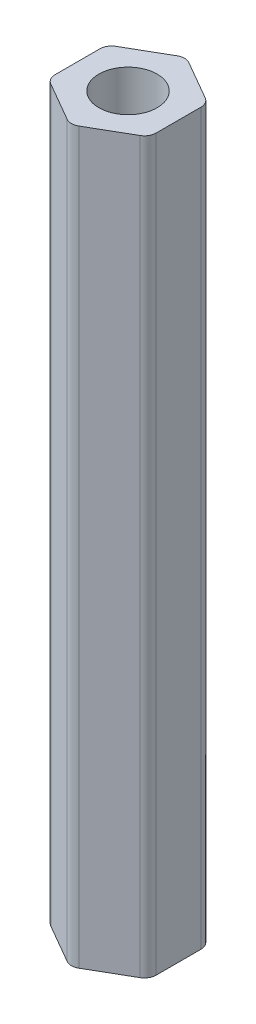
ISO-10303-21;
HEADER;
FILE_DESCRIPTION(('STEP AP214'),'2;1');
FILE_NAME('part.step','',(''),(''),'','','');
FILE_SCHEMA(('AUTOMOTIVE_DESIGN { 1 0 10303 214 1 1 1 1 }'));
ENDSEC;
DATA;
#1=APPLICATION_CONTEXT('core data for automotive mechanical design processes');
#2=APPLICATION_PROTOCOL_DEFINITION('international standard','automotive_design',2000,#1);
#3=PRODUCT_CONTEXT('',#1,'mechanical');
#4=PRODUCT('Part','Part','',(#3));
#5=PRODUCT_RELATED_PRODUCT_CATEGORY('part','',(#4));
#6=PRODUCT_DEFINITION_FORMATION('','',#4);
#7=PRODUCT_DEFINITION_CONTEXT('part definition',#1,'design');
#8=PRODUCT_DEFINITION('design','',#6,#7);
#9=PRODUCT_DEFINITION_SHAPE('','',#8);
#10=(LENGTH_UNIT() NAMED_UNIT(*) SI_UNIT(.MILLI.,.METRE.));
#11=(NAMED_UNIT(*) PLANE_ANGLE_UNIT() SI_UNIT($,.RADIAN.));
#12=(NAMED_UNIT(*) SI_UNIT($,.STERADIAN.) SOLID_ANGLE_UNIT());
#13=UNCERTAINTY_MEASURE_WITH_UNIT(LENGTH_MEASURE(1.E-05),#10,'distance_accuracy_value','');
#14=(GEOMETRIC_REPRESENTATION_CONTEXT(3) GLOBAL_UNCERTAINTY_ASSIGNED_CONTEXT((#13)) GLOBAL_UNIT_ASSIGNED_CONTEXT((#10,
#11,#12)) REPRESENTATION_CONTEXT('',''));
#15=CARTESIAN_POINT('',(0.,0.,0.));
#16=DIRECTION('',(0.,0.,1.));
#17=DIRECTION('',(1.,0.,0.));
#18=AXIS2_PLACEMENT_3D('',#15,#16,#17);
#19=CARTESIAN_POINT('',(0.,125.,0.));
#20=DIRECTION('',(0.,1.,0.));
#21=DIRECTION('',(0.,0.,1.));
#22=AXIS2_PLACEMENT_3D('',#19,#20,#21);
#23=PLANE('',#22);
#24=DIRECTION('',(0.,0.,1.));
#25=VECTOR('',#24,1.);
#26=CARTESIAN_POINT('',(-8.6602540378444,125.,-5.00000000000001));
#27=LINE('',#26,#25);
#28=CARTESIAN_POINT('',(-8.6602540378444,125.,-3.84529946162076));
#29=VERTEX_POINT('',#28);
#30=CARTESIAN_POINT('',(-8.6602540378444,125.,3.84529946162075));
#31=VERTEX_POINT('',#30);
#32=EDGE_CURVE('E229',#29,#31,#27,.T.);
#33=ORIENTED_EDGE('',*,*,#32,.T.);
#34=CARTESIAN_POINT('',(-6.6602540378444,125.,3.84529946162076));
#35=DIRECTION('',(0.,1.,0.));
#36=DIRECTION('',(0.,0.,1.));
#37=AXIS2_PLACEMENT_3D('',#34,#35,#36);
#38=CIRCLE('',#37,2.);
#39=CARTESIAN_POINT('',(-7.6602540378444,125.,5.57735026918963));
#40=VERTEX_POINT('',#39);
#41=EDGE_CURVE('E180',#31,#40,#38,.T.);
#42=ORIENTED_EDGE('',*,*,#41,.T.);
#43=DIRECTION('',(0.866025403784439,0.,0.5));
#44=VECTOR('',#43,1.);
#45=CARTESIAN_POINT('',(-8.6602540378444,125.,5.00000000000001));
#46=LINE('',#45,#44);
#47=CARTESIAN_POINT('',(-1.,125.,9.42264973081039));
#48=VERTEX_POINT('',#47);
#49=EDGE_CURVE('E142',#40,#48,#46,.T.);
#50=ORIENTED_EDGE('',*,*,#49,.T.);
#51=CARTESIAN_POINT('',(0.,125.,7.69059892324151));
#52=DIRECTION('',(0.,1.,0.));
#53=DIRECTION('',(0.,0.,1.));
#54=AXIS2_PLACEMENT_3D('',#51,#52,#53);
#55=CIRCLE('',#54,2.);
#56=CARTESIAN_POINT('',(0.999999999999997,125.,9.42264973081039));
#57=VERTEX_POINT('',#56);
#58=EDGE_CURVE('E171',#48,#57,#55,.T.);
#59=ORIENTED_EDGE('',*,*,#58,.T.);
#60=DIRECTION('',(0.866025403784439,0.,-0.5));
#61=VECTOR('',#60,1.);
#62=CARTESIAN_POINT('',(0.,125.,10.));
#63=LINE('',#62,#61);
#64=CARTESIAN_POINT('',(7.6602540378444,125.,5.57735026918963));
#65=VERTEX_POINT('',#64);
#66=EDGE_CURVE('E149',#57,#65,#63,.T.);
#67=ORIENTED_EDGE('',*,*,#66,.T.);
#68=CARTESIAN_POINT('',(6.6602540378444,125.,3.84529946162075));
#69=DIRECTION('',(0.,1.,0.));
#70=DIRECTION('',(0.,0.,1.));
#71=AXIS2_PLACEMENT_3D('',#68,#69,#70);
#72=CIRCLE('',#71,2.);
#73=CARTESIAN_POINT('',(8.6602540378444,125.,3.84529946162075));
#74=VERTEX_POINT('',#73);
#75=EDGE_CURVE('E173',#65,#74,#72,.T.);
#76=ORIENTED_EDGE('',*,*,#75,.T.);
#77=DIRECTION('',(0.,0.,-1.));
#78=VECTOR('',#77,1.);
#79=CARTESIAN_POINT('',(8.6602540378444,125.,5.));
#80=LINE('',#79,#78);
#81=CARTESIAN_POINT('',(8.6602540378444,125.,-3.84529946162076));
#82=VERTEX_POINT('',#81);
#83=EDGE_CURVE('E153',#74,#82,#80,.T.);
#84=ORIENTED_EDGE('',*,*,#83,.T.);
#85=CARTESIAN_POINT('',(6.6602540378444,125.,-3.84529946162076));
#86=DIRECTION('',(0.,1.,0.));
#87=DIRECTION('',(0.,0.,1.));
#88=AXIS2_PLACEMENT_3D('',#85,#86,#87);
#89=CIRCLE('',#88,2.);
#90=CARTESIAN_POINT('',(7.6602540378444,125.,-5.57735026918964));
#91=VERTEX_POINT('',#90);
#92=EDGE_CURVE('E175',#82,#91,#89,.T.);
#93=ORIENTED_EDGE('',*,*,#92,.T.);
#94=DIRECTION('',(-0.866025403784439,0.,-0.5));
#95=VECTOR('',#94,1.);
#96=CARTESIAN_POINT('',(8.6602540378444,125.,-5.00000000000001));
#97=LINE('',#96,#95);
#98=CARTESIAN_POINT('',(1.,125.,-9.42264973081039));
#99=VERTEX_POINT('',#98);
#100=EDGE_CURVE('E233',#91,#99,#97,.T.);
#101=ORIENTED_EDGE('',*,*,#100,.T.);
#102=CARTESIAN_POINT('',(0.,125.,-7.69059892324151));
#103=DIRECTION('',(0.,1.,0.));
#104=DIRECTION('',(0.,0.,1.));
#105=AXIS2_PLACEMENT_3D('',#102,#103,#104);
#106=CIRCLE('',#105,2.);
#107=CARTESIAN_POINT('',(-1.,125.,-9.42264973081039));
#108=VERTEX_POINT('',#107);
#109=EDGE_CURVE('E54',#99,#108,#106,.T.);
#110=ORIENTED_EDGE('',*,*,#109,.T.);
#111=DIRECTION('',(-0.866025403784439,0.,0.5));
#112=VECTOR('',#111,1.);
#113=CARTESIAN_POINT('',(0.,125.,-10.));
#114=LINE('',#113,#112);
#115=CARTESIAN_POINT('',(-7.6602540378444,125.,-5.57735026918964));
#116=VERTEX_POINT('',#115);
#117=EDGE_CURVE('E230',#108,#116,#114,.T.);
#118=ORIENTED_EDGE('',*,*,#117,.T.);
#119=CARTESIAN_POINT('',(-6.6602540378444,125.,-3.84529946162076));
#120=DIRECTION('',(0.,1.,0.));
#121=DIRECTION('',(0.,0.,1.));
#122=AXIS2_PLACEMENT_3D('',#119,#120,#121);
#123=CIRCLE('',#122,2.);
#124=EDGE_CURVE('E178',#116,#29,#123,.T.);
#125=ORIENTED_EDGE('',*,*,#124,.T.);
#126=EDGE_LOOP('',(#33,#42,#50,#59,#67,#76,#84,#93,#101,#110,#118,#125));
#127=FACE_BOUND('',#126,.T.);
#128=CARTESIAN_POINT('',(0.,125.,0.));
#129=DIRECTION('',(0.,1.,0.));
#130=DIRECTION('',(0.,0.,1.));
#131=AXIS2_PLACEMENT_3D('',#128,#129,#130);
#132=CIRCLE('',#131,5.);
#133=CARTESIAN_POINT('',(0.,125.,5.));
#134=VERTEX_POINT('',#133);
#135=EDGE_CURVE('E207',#134,#134,#132,.T.);
#136=ORIENTED_EDGE('',*,*,#135,.F.);
#137=EDGE_LOOP('',(#136));
#138=FACE_BOUND('',#137,.T.);
#139=ADVANCED_FACE('F32',(#127,#138),#23,.T.);
#140=CARTESIAN_POINT('',(0.,0.,0.));
#141=DIRECTION('',(0.,1.,0.));
#142=DIRECTION('',(0.,0.,1.));
#143=AXIS2_PLACEMENT_3D('',#140,#141,#142);
#144=PLANE('',#143);
#145=DIRECTION('',(0.866025403784439,0.,0.5));
#146=VECTOR('',#145,1.);
#147=CARTESIAN_POINT('',(-8.6602540378444,0.,5.00000000000001));
#148=LINE('',#147,#146);
#149=CARTESIAN_POINT('',(-7.6602540378444,0.,5.57735026918963));
#150=VERTEX_POINT('',#149);
#151=CARTESIAN_POINT('',(-1.,0.,9.42264973081039));
#152=VERTEX_POINT('',#151);
#153=EDGE_CURVE('E139',#150,#152,#148,.T.);
#154=ORIENTED_EDGE('',*,*,#153,.F.);
#155=CARTESIAN_POINT('',(-6.6602540378444,0.,3.84529946162076));
#156=DIRECTION('',(0.,1.,0.));
#157=DIRECTION('',(0.,0.,1.));
#158=AXIS2_PLACEMENT_3D('',#155,#156,#157);
#159=CIRCLE('',#158,2.);
#160=CARTESIAN_POINT('',(-8.6602540378444,0.,3.84529946162075));
#161=VERTEX_POINT('',#160);
#162=EDGE_CURVE('E122',#150,#161,#159,.F.);
#163=ORIENTED_EDGE('',*,*,#162,.T.);
#164=DIRECTION('',(0.,0.,1.));
#165=VECTOR('',#164,1.);
#166=CARTESIAN_POINT('',(-8.6602540378444,0.,-5.00000000000001));
#167=LINE('',#166,#165);
#168=CARTESIAN_POINT('',(-8.6602540378444,0.,-3.84529946162076));
#169=VERTEX_POINT('',#168);
#170=EDGE_CURVE('E150',#169,#161,#167,.T.);
#171=ORIENTED_EDGE('',*,*,#170,.F.);
#172=CARTESIAN_POINT('',(-6.6602540378444,0.,-3.84529946162076));
#173=DIRECTION('',(0.,1.,0.));
#174=DIRECTION('',(0.,0.,1.));
#175=AXIS2_PLACEMENT_3D('',#172,#173,#174);
#176=CIRCLE('',#175,2.);
#177=CARTESIAN_POINT('',(-7.6602540378444,0.,-5.57735026918964));
#178=VERTEX_POINT('',#177);
#179=EDGE_CURVE('E133',#169,#178,#176,.F.);
#180=ORIENTED_EDGE('',*,*,#179,.T.);
#181=DIRECTION('',(-0.866025403784439,0.,0.5));
#182=VECTOR('',#181,1.);
#183=CARTESIAN_POINT('',(0.,0.,-10.));
#184=LINE('',#183,#182);
#185=CARTESIAN_POINT('',(-1.,0.,-9.42264973081039));
#186=VERTEX_POINT('',#185);
#187=EDGE_CURVE('E155',#186,#178,#184,.T.);
#188=ORIENTED_EDGE('',*,*,#187,.F.);
#189=CARTESIAN_POINT('',(0.,0.,-7.69059892324151));
#190=DIRECTION('',(0.,1.,0.));
#191=DIRECTION('',(0.,0.,1.));
#192=AXIS2_PLACEMENT_3D('',#189,#190,#191);
#193=CIRCLE('',#192,2.);
#194=CARTESIAN_POINT('',(1.,0.,-9.42264973081039));
#195=VERTEX_POINT('',#194);
#196=EDGE_CURVE('E165',#186,#195,#193,.F.);
#197=ORIENTED_EDGE('',*,*,#196,.T.);
#198=DIRECTION('',(-0.866025403784439,0.,-0.5));
#199=VECTOR('',#198,1.);
#200=CARTESIAN_POINT('',(8.6602540378444,0.,-5.00000000000001));
#201=LINE('',#200,#199);
#202=CARTESIAN_POINT('',(7.6602540378444,0.,-5.57735026918964));
#203=VERTEX_POINT('',#202);
#204=EDGE_CURVE('E210',#203,#195,#201,.T.);
#205=ORIENTED_EDGE('',*,*,#204,.F.);
#206=CARTESIAN_POINT('',(6.6602540378444,0.,-3.84529946162076));
#207=DIRECTION('',(0.,1.,0.));
#208=DIRECTION('',(0.,0.,1.));
#209=AXIS2_PLACEMENT_3D('',#206,#207,#208);
#210=CIRCLE('',#209,2.);
#211=CARTESIAN_POINT('',(8.6602540378444,0.,-3.84529946162076));
#212=VERTEX_POINT('',#211);
#213=EDGE_CURVE('E163',#203,#212,#210,.F.);
#214=ORIENTED_EDGE('',*,*,#213,.T.);
#215=DIRECTION('',(0.,0.,-1.));
#216=VECTOR('',#215,1.);
#217=CARTESIAN_POINT('',(8.6602540378444,0.,5.));
#218=LINE('',#217,#216);
#219=CARTESIAN_POINT('',(8.6602540378444,0.,3.84529946162075));
#220=VERTEX_POINT('',#219);
#221=EDGE_CURVE('E206',#220,#212,#218,.T.);
#222=ORIENTED_EDGE('',*,*,#221,.F.);
#223=CARTESIAN_POINT('',(6.6602540378444,0.,3.84529946162075));
#224=DIRECTION('',(0.,1.,0.));
#225=DIRECTION('',(0.,0.,1.));
#226=AXIS2_PLACEMENT_3D('',#223,#224,#225);
#227=CIRCLE('',#226,2.);
#228=CARTESIAN_POINT('',(7.6602540378444,0.,5.57735026918963));
#229=VERTEX_POINT('',#228);
#230=EDGE_CURVE('E161',#220,#229,#227,.F.);
#231=ORIENTED_EDGE('',*,*,#230,.T.);
#232=DIRECTION('',(0.866025403784439,0.,-0.5));
#233=VECTOR('',#232,1.);
#234=CARTESIAN_POINT('',(0.,0.,10.));
#235=LINE('',#234,#233);
#236=CARTESIAN_POINT('',(0.999999999999997,0.,9.42264973081039));
#237=VERTEX_POINT('',#236);
#238=EDGE_CURVE('E201',#237,#229,#235,.T.);
#239=ORIENTED_EDGE('',*,*,#238,.F.);
#240=CARTESIAN_POINT('',(0.,0.,7.69059892324151));
#241=DIRECTION('',(0.,1.,0.));
#242=DIRECTION('',(0.,0.,1.));
#243=AXIS2_PLACEMENT_3D('',#240,#241,#242);
#244=CIRCLE('',#243,2.);
#245=EDGE_CURVE('E143',#237,#152,#244,.F.);
#246=ORIENTED_EDGE('',*,*,#245,.T.);
#247=EDGE_LOOP('',(#154,#163,#171,#180,#188,#197,#205,#214,#222,#231,#239,#246));
#248=FACE_BOUND('',#247,.T.);
#249=CARTESIAN_POINT('',(0.,0.,0.));
#250=DIRECTION('',(0.,1.,0.));
#251=DIRECTION('',(0.,0.,1.));
#252=AXIS2_PLACEMENT_3D('',#249,#250,#251);
#253=CIRCLE('',#252,5.);
#254=CARTESIAN_POINT('',(0.,0.,5.));
#255=VERTEX_POINT('',#254);
#256=EDGE_CURVE('E213',#255,#255,#253,.T.);
#257=ORIENTED_EDGE('',*,*,#256,.T.);
#258=EDGE_LOOP('',(#257));
#259=FACE_BOUND('',#258,.T.);
#260=ADVANCED_FACE('F146',(#248,#259),#144,.F.);
#261=CARTESIAN_POINT('',(0.,125.,10.));
#262=DIRECTION('',(-0.5,0.,-0.866025403784439));
#263=DIRECTION('',(-0.866025403784439,0.,0.5));
#264=AXIS2_PLACEMENT_3D('',#261,#262,#263);
#265=PLANE('',#264);
#266=ORIENTED_EDGE('',*,*,#238,.T.);
#267=DIRECTION('',(0.,-1.,0.));
#268=VECTOR('',#267,1.);
#269=CARTESIAN_POINT('',(7.6602540378444,125.,5.57735026918963));
#270=LINE('',#269,#268);
#271=EDGE_CURVE('E11',#229,#65,#270,.F.);
#272=ORIENTED_EDGE('',*,*,#271,.T.);
#273=ORIENTED_EDGE('',*,*,#66,.F.);
#274=DIRECTION('',(0.,-1.,0.));
#275=VECTOR('',#274,1.);
#276=CARTESIAN_POINT('',(0.999999999999997,125.,9.42264973081039));
#277=LINE('',#276,#275);
#278=EDGE_CURVE('E40',#57,#237,#277,.T.);
#279=ORIENTED_EDGE('',*,*,#278,.T.);
#280=EDGE_LOOP('',(#266,#272,#273,#279));
#281=FACE_BOUND('',#280,.T.);
#282=ADVANCED_FACE('F200',(#281),#265,.F.);
#283=CARTESIAN_POINT('',(8.6602540378444,125.,5.));
#284=DIRECTION('',(-1.,0.,0.));
#285=DIRECTION('',(0.,0.,1.));
#286=AXIS2_PLACEMENT_3D('',#283,#284,#285);
#287=PLANE('',#286);
#288=ORIENTED_EDGE('',*,*,#221,.T.);
#289=DIRECTION('',(0.,-1.,0.));
#290=VECTOR('',#289,1.);
#291=CARTESIAN_POINT('',(8.6602540378444,125.,-3.84529946162076));
#292=LINE('',#291,#290);
#293=EDGE_CURVE('E194',#212,#82,#292,.F.);
#294=ORIENTED_EDGE('',*,*,#293,.T.);
#295=ORIENTED_EDGE('',*,*,#83,.F.);
#296=DIRECTION('',(0.,-1.,0.));
#297=VECTOR('',#296,1.);
#298=CARTESIAN_POINT('',(8.6602540378444,125.,3.84529946162075));
#299=LINE('',#298,#297);
#300=EDGE_CURVE('E191',#74,#220,#299,.T.);
#301=ORIENTED_EDGE('',*,*,#300,.T.);
#302=EDGE_LOOP('',(#288,#294,#295,#301));
#303=FACE_BOUND('',#302,.T.);
#304=ADVANCED_FACE('F266',(#303),#287,.F.);
#305=CARTESIAN_POINT('',(8.6602540378444,125.,-5.00000000000001));
#306=DIRECTION('',(-0.5,0.,0.866025403784439));
#307=DIRECTION('',(0.866025403784439,0.,0.5));
#308=AXIS2_PLACEMENT_3D('',#305,#306,#307);
#309=PLANE('',#308);
#310=ORIENTED_EDGE('',*,*,#204,.T.);
#311=DIRECTION('',(0.,-1.,0.));
#312=VECTOR('',#311,1.);
#313=CARTESIAN_POINT('',(1.,125.,-9.42264973081039));
#314=LINE('',#313,#312);
#315=EDGE_CURVE('E189',#195,#99,#314,.F.);
#316=ORIENTED_EDGE('',*,*,#315,.T.);
#317=ORIENTED_EDGE('',*,*,#100,.F.);
#318=DIRECTION('',(0.,-1.,0.));
#319=VECTOR('',#318,1.);
#320=CARTESIAN_POINT('',(7.6602540378444,125.,-5.57735026918964));
#321=LINE('',#320,#319);
#322=EDGE_CURVE('E186',#91,#203,#321,.T.);
#323=ORIENTED_EDGE('',*,*,#322,.T.);
#324=EDGE_LOOP('',(#310,#316,#317,#323));
#325=FACE_BOUND('',#324,.T.);
#326=ADVANCED_FACE('F263',(#325),#309,.F.);
#327=CARTESIAN_POINT('',(0.,125.,-10.));
#328=DIRECTION('',(0.5,0.,0.866025403784439));
#329=DIRECTION('',(0.866025403784439,0.,-0.5));
#330=AXIS2_PLACEMENT_3D('',#327,#328,#329);
#331=PLANE('',#330);
#332=ORIENTED_EDGE('',*,*,#187,.T.);
#333=DIRECTION('',(0.,-1.,0.));
#334=VECTOR('',#333,1.);
#335=CARTESIAN_POINT('',(-7.6602540378444,125.,-5.57735026918964));
#336=LINE('',#335,#334);
#337=EDGE_CURVE('E47',#178,#116,#336,.F.);
#338=ORIENTED_EDGE('',*,*,#337,.T.);
#339=ORIENTED_EDGE('',*,*,#117,.F.);
#340=DIRECTION('',(0.,-1.,0.));
#341=VECTOR('',#340,1.);
#342=CARTESIAN_POINT('',(-1.,125.,-9.42264973081039));
#343=LINE('',#342,#341);
#344=EDGE_CURVE('E182',#108,#186,#343,.T.);
#345=ORIENTED_EDGE('',*,*,#344,.T.);
#346=EDGE_LOOP('',(#332,#338,#339,#345));
#347=FACE_BOUND('',#346,.T.);
#348=ADVANCED_FACE('F220',(#347),#331,.F.);
#349=CARTESIAN_POINT('',(-8.6602540378444,125.,-5.00000000000001));
#350=DIRECTION('',(1.,0.,0.));
#351=DIRECTION('',(0.,0.,-1.));
#352=AXIS2_PLACEMENT_3D('',#349,#350,#351);
#353=PLANE('',#352);
#354=ORIENTED_EDGE('',*,*,#170,.T.);
#355=DIRECTION('',(0.,-1.,0.));
#356=VECTOR('',#355,1.);
#357=CARTESIAN_POINT('',(-8.6602540378444,125.,3.84529946162075));
#358=LINE('',#357,#356);
#359=EDGE_CURVE('E127',#161,#31,#358,.F.);
#360=ORIENTED_EDGE('',*,*,#359,.T.);
#361=ORIENTED_EDGE('',*,*,#32,.F.);
#362=DIRECTION('',(0.,-1.,0.));
#363=VECTOR('',#362,1.);
#364=CARTESIAN_POINT('',(-8.6602540378444,125.,-3.84529946162076));
#365=LINE('',#364,#363);
#366=EDGE_CURVE('E132',#29,#169,#365,.T.);
#367=ORIENTED_EDGE('',*,*,#366,.T.);
#368=EDGE_LOOP('',(#354,#360,#361,#367));
#369=FACE_BOUND('',#368,.T.);
#370=ADVANCED_FACE('F232',(#369),#353,.F.);
#371=CARTESIAN_POINT('',(-8.6602540378444,125.,5.00000000000001));
#372=DIRECTION('',(0.5,0.,-0.866025403784439));
#373=DIRECTION('',(-0.866025403784439,0.,-0.5));
#374=AXIS2_PLACEMENT_3D('',#371,#372,#373);
#375=PLANE('',#374);
#376=ORIENTED_EDGE('',*,*,#49,.F.);
#377=DIRECTION('',(0.,-1.,0.));
#378=VECTOR('',#377,1.);
#379=CARTESIAN_POINT('',(-7.6602540378444,125.,5.57735026918963));
#380=LINE('',#379,#378);
#381=EDGE_CURVE('E126',#40,#150,#380,.T.);
#382=ORIENTED_EDGE('',*,*,#381,.T.);
#383=ORIENTED_EDGE('',*,*,#153,.T.);
#384=DIRECTION('',(0.,-1.,0.));
#385=VECTOR('',#384,1.);
#386=CARTESIAN_POINT('',(-1.,125.,9.42264973081039));
#387=LINE('',#386,#385);
#388=EDGE_CURVE('E144',#152,#48,#387,.F.);
#389=ORIENTED_EDGE('',*,*,#388,.T.);
#390=EDGE_LOOP('',(#376,#382,#383,#389));
#391=FACE_BOUND('',#390,.T.);
#392=ADVANCED_FACE('F138',(#391),#375,.F.);
#393=CARTESIAN_POINT('',(0.,125.,0.));
#394=DIRECTION('',(0.,-1.,0.));
#395=DIRECTION('',(0.,0.,-1.));
#396=AXIS2_PLACEMENT_3D('',#393,#394,#395);
#397=CYLINDRICAL_SURFACE('',#396,5.);
#398=ORIENTED_EDGE('',*,*,#135,.T.);
#399=EDGE_LOOP('',(#398));
#400=FACE_BOUND('',#399,.T.);
#401=ORIENTED_EDGE('',*,*,#256,.F.);
#402=EDGE_LOOP('',(#401));
#403=FACE_BOUND('',#402,.T.);
#404=ADVANCED_FACE('F242',(#400,#403),#397,.F.);
#405=CARTESIAN_POINT('',(-6.6602540378444,125.,3.84529946162076));
#406=DIRECTION('',(0.,-1.,0.));
#407=DIRECTION('',(0.,0.,-1.));
#408=AXIS2_PLACEMENT_3D('',#405,#406,#407);
#409=CYLINDRICAL_SURFACE('',#408,2.);
#410=ORIENTED_EDGE('',*,*,#41,.F.);
#411=ORIENTED_EDGE('',*,*,#359,.F.);
#412=ORIENTED_EDGE('',*,*,#162,.F.);
#413=ORIENTED_EDGE('',*,*,#381,.F.);
#414=EDGE_LOOP('',(#410,#411,#412,#413));
#415=FACE_BOUND('',#414,.T.);
#416=ADVANCED_FACE('F125',(#415),#409,.T.);
#417=CARTESIAN_POINT('',(-6.6602540378444,125.,-3.84529946162076));
#418=DIRECTION('',(0.,-1.,0.));
#419=DIRECTION('',(0.,0.,-1.));
#420=AXIS2_PLACEMENT_3D('',#417,#418,#419);
#421=CYLINDRICAL_SURFACE('',#420,2.);
#422=ORIENTED_EDGE('',*,*,#124,.F.);
#423=ORIENTED_EDGE('',*,*,#337,.F.);
#424=ORIENTED_EDGE('',*,*,#179,.F.);
#425=ORIENTED_EDGE('',*,*,#366,.F.);
#426=EDGE_LOOP('',(#422,#423,#424,#425));
#427=FACE_BOUND('',#426,.T.);
#428=ADVANCED_FACE('F224',(#427),#421,.T.);
#429=CARTESIAN_POINT('',(0.,125.,-7.69059892324151));
#430=DIRECTION('',(0.,-1.,0.));
#431=DIRECTION('',(0.,0.,-1.));
#432=AXIS2_PLACEMENT_3D('',#429,#430,#431);
#433=CYLINDRICAL_SURFACE('',#432,2.);
#434=ORIENTED_EDGE('',*,*,#109,.F.);
#435=ORIENTED_EDGE('',*,*,#315,.F.);
#436=ORIENTED_EDGE('',*,*,#196,.F.);
#437=ORIENTED_EDGE('',*,*,#344,.F.);
#438=EDGE_LOOP('',(#434,#435,#436,#437));
#439=FACE_BOUND('',#438,.T.);
#440=ADVANCED_FACE('F275',(#439),#433,.T.);
#441=CARTESIAN_POINT('',(6.6602540378444,125.,-3.84529946162076));
#442=DIRECTION('',(0.,-1.,0.));
#443=DIRECTION('',(0.,0.,-1.));
#444=AXIS2_PLACEMENT_3D('',#441,#442,#443);
#445=CYLINDRICAL_SURFACE('',#444,2.);
#446=ORIENTED_EDGE('',*,*,#92,.F.);
#447=ORIENTED_EDGE('',*,*,#293,.F.);
#448=ORIENTED_EDGE('',*,*,#213,.F.);
#449=ORIENTED_EDGE('',*,*,#322,.F.);
#450=EDGE_LOOP('',(#446,#447,#448,#449));
#451=FACE_BOUND('',#450,.T.);
#452=ADVANCED_FACE('F278',(#451),#445,.T.);
#453=CARTESIAN_POINT('',(6.6602540378444,125.,3.84529946162075));
#454=DIRECTION('',(0.,-1.,0.));
#455=DIRECTION('',(0.,0.,-1.));
#456=AXIS2_PLACEMENT_3D('',#453,#454,#455);
#457=CYLINDRICAL_SURFACE('',#456,2.);
#458=ORIENTED_EDGE('',*,*,#75,.F.);
#459=ORIENTED_EDGE('',*,*,#271,.F.);
#460=ORIENTED_EDGE('',*,*,#230,.F.);
#461=ORIENTED_EDGE('',*,*,#300,.F.);
#462=EDGE_LOOP('',(#458,#459,#460,#461));
#463=FACE_BOUND('',#462,.T.);
#464=ADVANCED_FACE('F281',(#463),#457,.T.);
#465=CARTESIAN_POINT('',(0.,125.,7.69059892324151));
#466=DIRECTION('',(0.,-1.,0.));
#467=DIRECTION('',(0.,0.,-1.));
#468=AXIS2_PLACEMENT_3D('',#465,#466,#467);
#469=CYLINDRICAL_SURFACE('',#468,2.);
#470=ORIENTED_EDGE('',*,*,#58,.F.);
#471=ORIENTED_EDGE('',*,*,#388,.F.);
#472=ORIENTED_EDGE('',*,*,#245,.F.);
#473=ORIENTED_EDGE('',*,*,#278,.F.);
#474=EDGE_LOOP('',(#470,#471,#472,#473));
#475=FACE_BOUND('',#474,.T.);
#476=ADVANCED_FACE('F34',(#475),#469,.T.);
#477=CLOSED_SHELL('',(#139,#260,#282,#304,#326,#348,#370,#392,#404,#416,#428,#440,#452,#464,#476));
#478=MANIFOLD_SOLID_BREP('B2',#477);
#479=ADVANCED_BREP_SHAPE_REPRESENTATION('',(#18,#478),#14);
#480=SHAPE_DEFINITION_REPRESENTATION(#9,#479);
ENDSEC;
END-ISO-10303-21;
